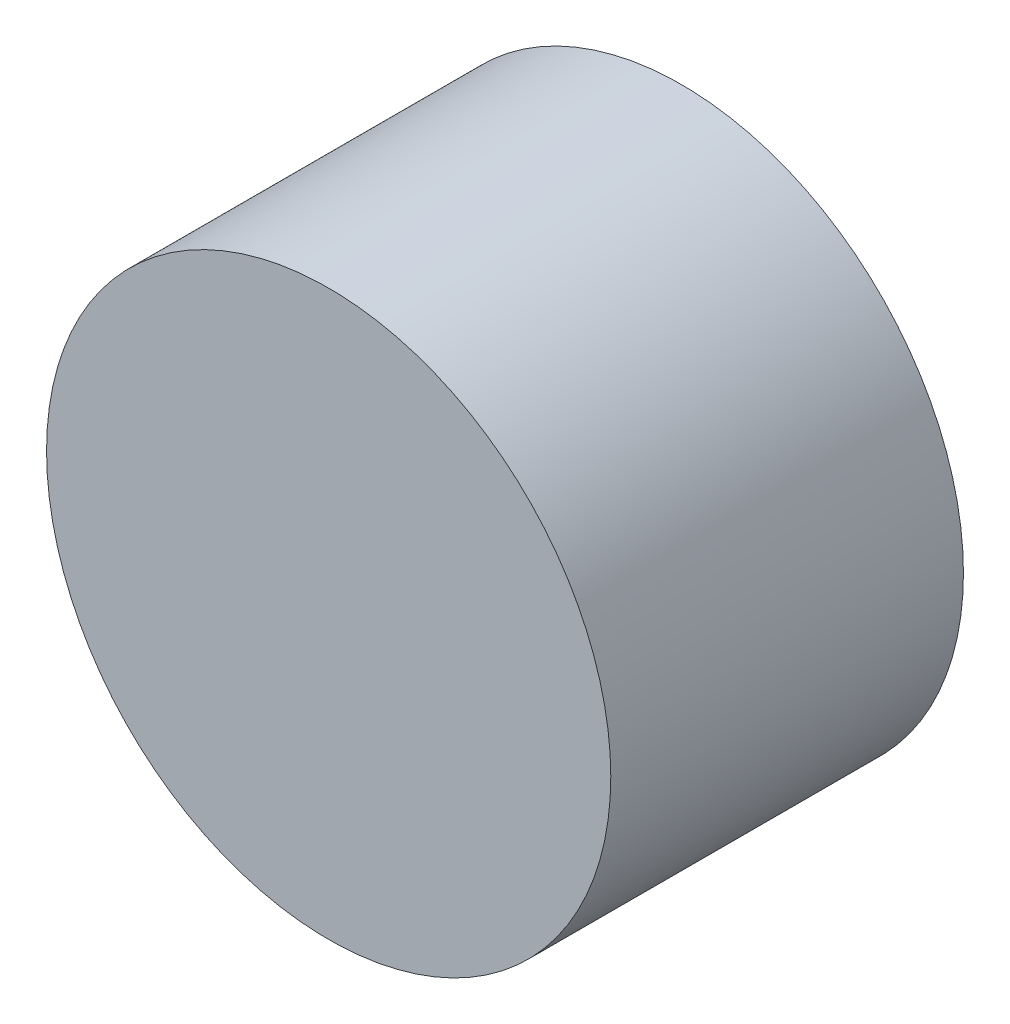
ISO-10303-21;
HEADER;
FILE_DESCRIPTION(('STEP AP214'),'2;1');
FILE_NAME('part.step','',(''),(''),'','','');
FILE_SCHEMA(('AUTOMOTIVE_DESIGN { 1 0 10303 214 1 1 1 1 }'));
ENDSEC;
DATA;
#1=APPLICATION_CONTEXT('core data for automotive mechanical design processes');
#2=APPLICATION_PROTOCOL_DEFINITION('international standard','automotive_design',2000,#1);
#3=PRODUCT_CONTEXT('',#1,'mechanical');
#4=PRODUCT('Part','Part','',(#3));
#5=PRODUCT_RELATED_PRODUCT_CATEGORY('part','',(#4));
#6=PRODUCT_DEFINITION_FORMATION('','',#4);
#7=PRODUCT_DEFINITION_CONTEXT('part definition',#1,'design');
#8=PRODUCT_DEFINITION('design','',#6,#7);
#9=PRODUCT_DEFINITION_SHAPE('','',#8);
#10=(LENGTH_UNIT() NAMED_UNIT(*) SI_UNIT(.MILLI.,.METRE.));
#11=(NAMED_UNIT(*) PLANE_ANGLE_UNIT() SI_UNIT($,.RADIAN.));
#12=(NAMED_UNIT(*) SI_UNIT($,.STERADIAN.) SOLID_ANGLE_UNIT());
#13=UNCERTAINTY_MEASURE_WITH_UNIT(LENGTH_MEASURE(1.E-05),#10,'distance_accuracy_value','');
#14=(GEOMETRIC_REPRESENTATION_CONTEXT(3) GLOBAL_UNCERTAINTY_ASSIGNED_CONTEXT((#13)) GLOBAL_UNIT_ASSIGNED_CONTEXT((#10,
#11,#12)) REPRESENTATION_CONTEXT('',''));
#15=CARTESIAN_POINT('',(0.,0.,0.));
#16=DIRECTION('',(0.,0.,1.));
#17=DIRECTION('',(1.,0.,0.));
#18=AXIS2_PLACEMENT_3D('',#15,#16,#17);
#19=CARTESIAN_POINT('',(0.,0.,5.));
#20=DIRECTION('',(0.,0.,-1.));
#21=DIRECTION('',(-1.,0.,0.));
#22=AXIS2_PLACEMENT_3D('',#19,#20,#21);
#23=CYLINDRICAL_SURFACE('',#22,4.);
#24=CARTESIAN_POINT('',(0.,0.,5.));
#25=DIRECTION('',(0.,0.,1.));
#26=DIRECTION('',(1.,0.,0.));
#27=AXIS2_PLACEMENT_3D('',#24,#25,#26);
#28=CIRCLE('',#27,4.);
#29=CARTESIAN_POINT('',(4.,0.,5.));
#30=VERTEX_POINT('',#29);
#31=EDGE_CURVE('E10',#30,#30,#28,.T.);
#32=ORIENTED_EDGE('',*,*,#31,.F.);
#33=EDGE_LOOP('',(#32));
#34=FACE_BOUND('',#33,.T.);
#35=CARTESIAN_POINT('',(0.,0.,0.));
#36=DIRECTION('',(0.,0.,1.));
#37=DIRECTION('',(1.,0.,0.));
#38=AXIS2_PLACEMENT_3D('',#35,#36,#37);
#39=CIRCLE('',#38,4.);
#40=CARTESIAN_POINT('',(4.,0.,0.));
#41=VERTEX_POINT('',#40);
#42=EDGE_CURVE('E40',#41,#41,#39,.T.);
#43=ORIENTED_EDGE('',*,*,#42,.T.);
#44=EDGE_LOOP('',(#43));
#45=FACE_BOUND('',#44,.T.);
#46=ADVANCED_FACE('F37',(#34,#45),#23,.T.);
#47=CARTESIAN_POINT('',(0.,0.,5.));
#48=DIRECTION('',(0.,0.,1.));
#49=DIRECTION('',(1.,0.,0.));
#50=AXIS2_PLACEMENT_3D('',#47,#48,#49);
#51=PLANE('',#50);
#52=ORIENTED_EDGE('',*,*,#31,.T.);
#53=EDGE_LOOP('',(#52));
#54=FACE_BOUND('',#53,.T.);
#55=ADVANCED_FACE('F54',(#54),#51,.T.);
#56=CARTESIAN_POINT('',(0.,0.,0.));
#57=DIRECTION('',(0.,0.,1.));
#58=DIRECTION('',(1.,0.,0.));
#59=AXIS2_PLACEMENT_3D('',#56,#57,#58);
#60=PLANE('',#59);
#61=ORIENTED_EDGE('',*,*,#42,.F.);
#62=EDGE_LOOP('',(#61));
#63=FACE_BOUND('',#62,.T.);
#64=ADVANCED_FACE('F52',(#63),#60,.F.);
#65=CLOSED_SHELL('',(#46,#55,#64));
#66=MANIFOLD_SOLID_BREP('B2',#65);
#67=ADVANCED_BREP_SHAPE_REPRESENTATION('',(#18,#66),#14);
#68=SHAPE_DEFINITION_REPRESENTATION(#9,#67);
ENDSEC;
END-ISO-10303-21;
